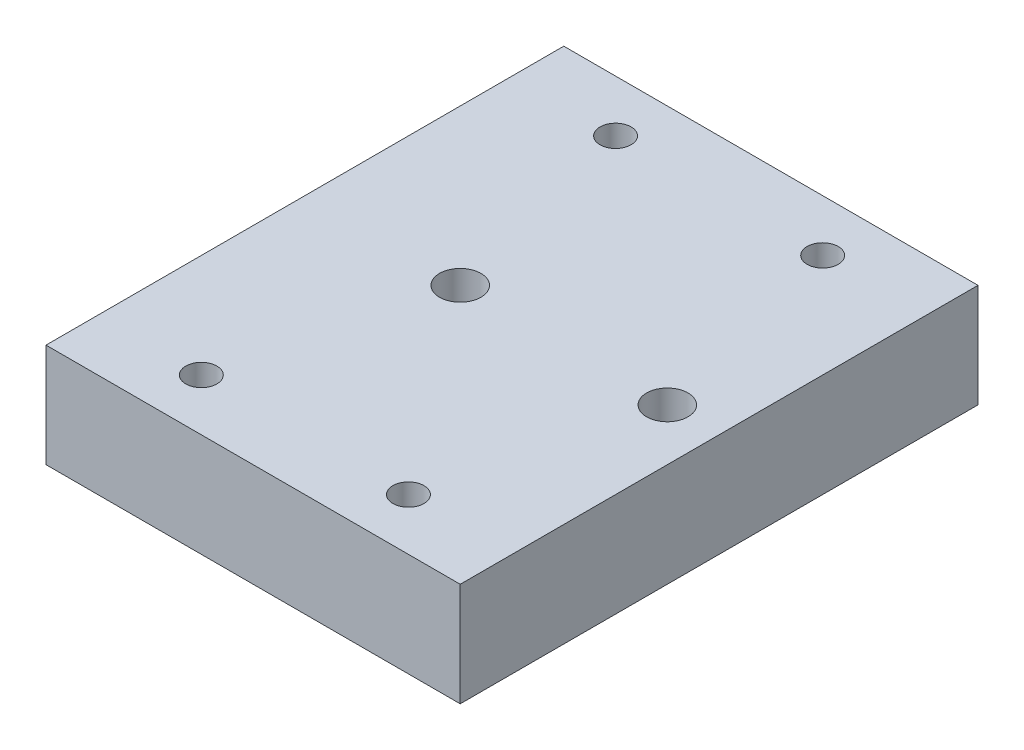
ISO-10303-21;
HEADER;
FILE_DESCRIPTION(('STEP AP214'),'2;1');
FILE_NAME('part.step','',(''),(''),'','','');
FILE_SCHEMA(('AUTOMOTIVE_DESIGN { 1 0 10303 214 1 1 1 1 }'));
ENDSEC;
DATA;
#1=APPLICATION_CONTEXT('core data for automotive mechanical design processes');
#2=APPLICATION_PROTOCOL_DEFINITION('international standard','automotive_design',2000,#1);
#3=PRODUCT_CONTEXT('',#1,'mechanical');
#4=PRODUCT('Part','Part','',(#3));
#5=PRODUCT_RELATED_PRODUCT_CATEGORY('part','',(#4));
#6=PRODUCT_DEFINITION_FORMATION('','',#4);
#7=PRODUCT_DEFINITION_CONTEXT('part definition',#1,'design');
#8=PRODUCT_DEFINITION('design','',#6,#7);
#9=PRODUCT_DEFINITION_SHAPE('','',#8);
#10=(LENGTH_UNIT() NAMED_UNIT(*) SI_UNIT(.MILLI.,.METRE.));
#11=(NAMED_UNIT(*) PLANE_ANGLE_UNIT() SI_UNIT($,.RADIAN.));
#12=(NAMED_UNIT(*) SI_UNIT($,.STERADIAN.) SOLID_ANGLE_UNIT());
#13=UNCERTAINTY_MEASURE_WITH_UNIT(LENGTH_MEASURE(1.E-05),#10,'distance_accuracy_value','');
#14=(GEOMETRIC_REPRESENTATION_CONTEXT(3) GLOBAL_UNCERTAINTY_ASSIGNED_CONTEXT((#13)) GLOBAL_UNIT_ASSIGNED_CONTEXT((#10,
#11,#12)) REPRESENTATION_CONTEXT('',''));
#15=CARTESIAN_POINT('',(0.,0.,0.));
#16=DIRECTION('',(0.,0.,1.));
#17=DIRECTION('',(1.,0.,0.));
#18=AXIS2_PLACEMENT_3D('',#15,#16,#17);
#19=CARTESIAN_POINT('',(0.,20.,0.));
#20=DIRECTION('',(0.,-1.,0.));
#21=DIRECTION('',(0.,0.,-1.));
#22=AXIS2_PLACEMENT_3D('',#19,#20,#21);
#23=PLANE('',#22);
#24=DIRECTION('',(0.,0.,1.));
#25=VECTOR('',#24,1.);
#26=CARTESIAN_POINT('',(0.,20.,0.));
#27=LINE('',#26,#25);
#28=CARTESIAN_POINT('',(0.,20.,-100.));
#29=VERTEX_POINT('',#28);
#30=CARTESIAN_POINT('',(0.,20.,0.));
#31=VERTEX_POINT('',#30);
#32=EDGE_CURVE('E87',#29,#31,#27,.T.);
#33=ORIENTED_EDGE('',*,*,#32,.T.);
#34=DIRECTION('',(1.,0.,0.));
#35=VECTOR('',#34,1.);
#36=CARTESIAN_POINT('',(0.,20.,0.));
#37=LINE('',#36,#35);
#38=CARTESIAN_POINT('',(80.,20.,0.));
#39=VERTEX_POINT('',#38);
#40=EDGE_CURVE('E82',#31,#39,#37,.T.);
#41=ORIENTED_EDGE('',*,*,#40,.T.);
#42=DIRECTION('',(0.,0.,-1.));
#43=VECTOR('',#42,1.);
#44=CARTESIAN_POINT('',(80.,20.,0.));
#45=LINE('',#44,#43);
#46=CARTESIAN_POINT('',(80.,20.,-100.));
#47=VERTEX_POINT('',#46);
#48=EDGE_CURVE('E85',#39,#47,#45,.T.);
#49=ORIENTED_EDGE('',*,*,#48,.T.);
#50=DIRECTION('',(-1.,0.,0.));
#51=VECTOR('',#50,1.);
#52=CARTESIAN_POINT('',(0.,20.,-100.));
#53=LINE('',#52,#51);
#54=EDGE_CURVE('E52',#47,#29,#53,.T.);
#55=ORIENTED_EDGE('',*,*,#54,.T.);
#56=EDGE_LOOP('',(#33,#41,#49,#55));
#57=FACE_BOUND('',#56,.T.);
#58=CARTESIAN_POINT('',(20.,20.,-90.));
#59=DIRECTION('',(0.,1.,0.));
#60=DIRECTION('',(0.,0.,1.));
#61=AXIS2_PLACEMENT_3D('',#58,#59,#60);
#62=CIRCLE('',#61,3.);
#63=CARTESIAN_POINT('',(20.,20.,-87.));
#64=VERTEX_POINT('',#63);
#65=EDGE_CURVE('E102',#64,#64,#62,.T.);
#66=ORIENTED_EDGE('',*,*,#65,.F.);
#67=EDGE_LOOP('',(#66));
#68=FACE_BOUND('',#67,.T.);
#69=CARTESIAN_POINT('',(60.,20.,-90.));
#70=DIRECTION('',(0.,1.,0.));
#71=DIRECTION('',(0.,0.,1.));
#72=AXIS2_PLACEMENT_3D('',#69,#70,#71);
#73=CIRCLE('',#72,3.00000000000001);
#74=CARTESIAN_POINT('',(60.,20.,-87.));
#75=VERTEX_POINT('',#74);
#76=EDGE_CURVE('E117',#75,#75,#73,.T.);
#77=ORIENTED_EDGE('',*,*,#76,.F.);
#78=EDGE_LOOP('',(#77));
#79=FACE_BOUND('',#78,.T.);
#80=CARTESIAN_POINT('',(20.,20.,-10.));
#81=DIRECTION('',(0.,1.,0.));
#82=DIRECTION('',(0.,0.,1.));
#83=AXIS2_PLACEMENT_3D('',#80,#81,#82);
#84=CIRCLE('',#83,3.);
#85=CARTESIAN_POINT('',(20.,20.,-7.));
#86=VERTEX_POINT('',#85);
#87=EDGE_CURVE('E123',#86,#86,#84,.T.);
#88=ORIENTED_EDGE('',*,*,#87,.F.);
#89=EDGE_LOOP('',(#88));
#90=FACE_BOUND('',#89,.T.);
#91=CARTESIAN_POINT('',(60.,20.,-10.));
#92=DIRECTION('',(0.,1.,0.));
#93=DIRECTION('',(0.,0.,1.));
#94=AXIS2_PLACEMENT_3D('',#91,#92,#93);
#95=CIRCLE('',#94,3.00000000000001);
#96=CARTESIAN_POINT('',(60.,20.,-6.99999999999999));
#97=VERTEX_POINT('',#96);
#98=EDGE_CURVE('E129',#97,#97,#95,.T.);
#99=ORIENTED_EDGE('',*,*,#98,.F.);
#100=EDGE_LOOP('',(#99));
#101=FACE_BOUND('',#100,.T.);
#102=CARTESIAN_POINT('',(30.,20.,-50.));
#103=DIRECTION('',(0.,1.,0.));
#104=DIRECTION('',(0.,0.,1.));
#105=AXIS2_PLACEMENT_3D('',#102,#103,#104);
#106=CIRCLE('',#105,4.00000000000001);
#107=CARTESIAN_POINT('',(30.,20.,-46.));
#108=VERTEX_POINT('',#107);
#109=EDGE_CURVE('E135',#108,#108,#106,.T.);
#110=ORIENTED_EDGE('',*,*,#109,.F.);
#111=EDGE_LOOP('',(#110));
#112=FACE_BOUND('',#111,.T.);
#113=CARTESIAN_POINT('',(70.,20.,-50.));
#114=DIRECTION('',(0.,1.,0.));
#115=DIRECTION('',(0.,0.,1.));
#116=AXIS2_PLACEMENT_3D('',#113,#114,#115);
#117=CIRCLE('',#116,4.00000000000001);
#118=CARTESIAN_POINT('',(70.,20.,-46.));
#119=VERTEX_POINT('',#118);
#120=EDGE_CURVE('E141',#119,#119,#117,.T.);
#121=ORIENTED_EDGE('',*,*,#120,.F.);
#122=EDGE_LOOP('',(#121));
#123=FACE_BOUND('',#122,.T.);
#124=ADVANCED_FACE('F35',(#57,#68,#79,#90,#101,#112,#123),#23,.F.);
#125=CARTESIAN_POINT('',(0.,0.,0.));
#126=DIRECTION('',(0.,-1.,0.));
#127=DIRECTION('',(0.,0.,-1.));
#128=AXIS2_PLACEMENT_3D('',#125,#126,#127);
#129=PLANE('',#128);
#130=CARTESIAN_POINT('',(30.,0.,-50.));
#131=DIRECTION('',(0.,1.,0.));
#132=DIRECTION('',(0.,0.,1.));
#133=AXIS2_PLACEMENT_3D('',#130,#131,#132);
#134=CIRCLE('',#133,4.00000000000001);
#135=CARTESIAN_POINT('',(30.,0.,-46.));
#136=VERTEX_POINT('',#135);
#137=EDGE_CURVE('E138',#136,#136,#134,.T.);
#138=ORIENTED_EDGE('',*,*,#137,.T.);
#139=EDGE_LOOP('',(#138));
#140=FACE_BOUND('',#139,.T.);
#141=CARTESIAN_POINT('',(20.,0.,-10.));
#142=DIRECTION('',(0.,1.,0.));
#143=DIRECTION('',(0.,0.,1.));
#144=AXIS2_PLACEMENT_3D('',#141,#142,#143);
#145=CIRCLE('',#144,3.);
#146=CARTESIAN_POINT('',(20.,0.,-7.));
#147=VERTEX_POINT('',#146);
#148=EDGE_CURVE('E126',#147,#147,#145,.T.);
#149=ORIENTED_EDGE('',*,*,#148,.T.);
#150=EDGE_LOOP('',(#149));
#151=FACE_BOUND('',#150,.T.);
#152=CARTESIAN_POINT('',(20.,0.,-90.));
#153=DIRECTION('',(0.,1.,0.));
#154=DIRECTION('',(0.,0.,1.));
#155=AXIS2_PLACEMENT_3D('',#152,#153,#154);
#156=CIRCLE('',#155,3.);
#157=CARTESIAN_POINT('',(20.,0.,-87.));
#158=VERTEX_POINT('',#157);
#159=EDGE_CURVE('E114',#158,#158,#156,.T.);
#160=ORIENTED_EDGE('',*,*,#159,.T.);
#161=EDGE_LOOP('',(#160));
#162=FACE_BOUND('',#161,.T.);
#163=DIRECTION('',(0.,0.,1.));
#164=VECTOR('',#163,1.);
#165=CARTESIAN_POINT('',(0.,0.,0.));
#166=LINE('',#165,#164);
#167=CARTESIAN_POINT('',(0.,0.,-100.));
#168=VERTEX_POINT('',#167);
#169=CARTESIAN_POINT('',(0.,0.,0.));
#170=VERTEX_POINT('',#169);
#171=EDGE_CURVE('E99',#168,#170,#166,.T.);
#172=ORIENTED_EDGE('',*,*,#171,.F.);
#173=DIRECTION('',(-1.,0.,0.));
#174=VECTOR('',#173,1.);
#175=CARTESIAN_POINT('',(0.,0.,-100.));
#176=LINE('',#175,#174);
#177=CARTESIAN_POINT('',(80.,0.,-100.));
#178=VERTEX_POINT('',#177);
#179=EDGE_CURVE('E75',#178,#168,#176,.T.);
#180=ORIENTED_EDGE('',*,*,#179,.F.);
#181=DIRECTION('',(0.,0.,-1.));
#182=VECTOR('',#181,1.);
#183=CARTESIAN_POINT('',(80.,0.,0.));
#184=LINE('',#183,#182);
#185=CARTESIAN_POINT('',(80.,0.,0.));
#186=VERTEX_POINT('',#185);
#187=EDGE_CURVE('E69',#186,#178,#184,.T.);
#188=ORIENTED_EDGE('',*,*,#187,.F.);
#189=DIRECTION('',(1.,0.,0.));
#190=VECTOR('',#189,1.);
#191=CARTESIAN_POINT('',(0.,0.,0.));
#192=LINE('',#191,#190);
#193=EDGE_CURVE('E91',#170,#186,#192,.T.);
#194=ORIENTED_EDGE('',*,*,#193,.F.);
#195=EDGE_LOOP('',(#172,#180,#188,#194));
#196=FACE_BOUND('',#195,.T.);
#197=CARTESIAN_POINT('',(60.,0.,-90.));
#198=DIRECTION('',(0.,1.,0.));
#199=DIRECTION('',(0.,0.,1.));
#200=AXIS2_PLACEMENT_3D('',#197,#198,#199);
#201=CIRCLE('',#200,3.00000000000001);
#202=CARTESIAN_POINT('',(60.,0.,-87.));
#203=VERTEX_POINT('',#202);
#204=EDGE_CURVE('E120',#203,#203,#201,.T.);
#205=ORIENTED_EDGE('',*,*,#204,.T.);
#206=EDGE_LOOP('',(#205));
#207=FACE_BOUND('',#206,.T.);
#208=CARTESIAN_POINT('',(60.,0.,-10.));
#209=DIRECTION('',(0.,1.,0.));
#210=DIRECTION('',(0.,0.,1.));
#211=AXIS2_PLACEMENT_3D('',#208,#209,#210);
#212=CIRCLE('',#211,3.00000000000001);
#213=CARTESIAN_POINT('',(60.,0.,-6.99999999999999));
#214=VERTEX_POINT('',#213);
#215=EDGE_CURVE('E132',#214,#214,#212,.T.);
#216=ORIENTED_EDGE('',*,*,#215,.T.);
#217=EDGE_LOOP('',(#216));
#218=FACE_BOUND('',#217,.T.);
#219=CARTESIAN_POINT('',(70.,0.,-50.));
#220=DIRECTION('',(0.,1.,0.));
#221=DIRECTION('',(0.,0.,1.));
#222=AXIS2_PLACEMENT_3D('',#219,#220,#221);
#223=CIRCLE('',#222,4.00000000000001);
#224=CARTESIAN_POINT('',(70.,0.,-46.));
#225=VERTEX_POINT('',#224);
#226=EDGE_CURVE('E144',#225,#225,#223,.T.);
#227=ORIENTED_EDGE('',*,*,#226,.T.);
#228=EDGE_LOOP('',(#227));
#229=FACE_BOUND('',#228,.T.);
#230=ADVANCED_FACE('F110',(#140,#151,#162,#196,#207,#218,#229),#129,.T.);
#231=CARTESIAN_POINT('',(0.,20.,0.));
#232=DIRECTION('',(1.,0.,0.));
#233=DIRECTION('',(0.,0.,-1.));
#234=AXIS2_PLACEMENT_3D('',#231,#232,#233);
#235=PLANE('',#234);
#236=ORIENTED_EDGE('',*,*,#171,.T.);
#237=DIRECTION('',(0.,-1.,0.));
#238=VECTOR('',#237,1.);
#239=CARTESIAN_POINT('',(0.,20.,0.));
#240=LINE('',#239,#238);
#241=EDGE_CURVE('E11',#31,#170,#240,.T.);
#242=ORIENTED_EDGE('',*,*,#241,.F.);
#243=ORIENTED_EDGE('',*,*,#32,.F.);
#244=DIRECTION('',(0.,-1.,0.));
#245=VECTOR('',#244,1.);
#246=CARTESIAN_POINT('',(0.,20.,-100.));
#247=LINE('',#246,#245);
#248=EDGE_CURVE('E95',#29,#168,#247,.T.);
#249=ORIENTED_EDGE('',*,*,#248,.T.);
#250=EDGE_LOOP('',(#236,#242,#243,#249));
#251=FACE_BOUND('',#250,.T.);
#252=ADVANCED_FACE('F37',(#251),#235,.F.);
#253=CARTESIAN_POINT('',(0.,20.,0.));
#254=DIRECTION('',(0.,0.,-1.));
#255=DIRECTION('',(-1.,0.,0.));
#256=AXIS2_PLACEMENT_3D('',#253,#254,#255);
#257=PLANE('',#256);
#258=ORIENTED_EDGE('',*,*,#193,.T.);
#259=DIRECTION('',(0.,-1.,0.));
#260=VECTOR('',#259,1.);
#261=CARTESIAN_POINT('',(80.,20.,0.));
#262=LINE('',#261,#260);
#263=EDGE_CURVE('E44',#39,#186,#262,.T.);
#264=ORIENTED_EDGE('',*,*,#263,.F.);
#265=ORIENTED_EDGE('',*,*,#40,.F.);
#266=ORIENTED_EDGE('',*,*,#241,.T.);
#267=EDGE_LOOP('',(#258,#264,#265,#266));
#268=FACE_BOUND('',#267,.T.);
#269=ADVANCED_FACE('F90',(#268),#257,.F.);
#270=CARTESIAN_POINT('',(80.,20.,0.));
#271=DIRECTION('',(-1.,0.,0.));
#272=DIRECTION('',(0.,0.,1.));
#273=AXIS2_PLACEMENT_3D('',#270,#271,#272);
#274=PLANE('',#273);
#275=ORIENTED_EDGE('',*,*,#187,.T.);
#276=DIRECTION('',(0.,-1.,0.));
#277=VECTOR('',#276,1.);
#278=CARTESIAN_POINT('',(80.,20.,-100.));
#279=LINE('',#278,#277);
#280=EDGE_CURVE('E92',#47,#178,#279,.T.);
#281=ORIENTED_EDGE('',*,*,#280,.F.);
#282=ORIENTED_EDGE('',*,*,#48,.F.);
#283=ORIENTED_EDGE('',*,*,#263,.T.);
#284=EDGE_LOOP('',(#275,#281,#282,#283));
#285=FACE_BOUND('',#284,.T.);
#286=ADVANCED_FACE('F93',(#285),#274,.F.);
#287=CARTESIAN_POINT('',(0.,20.,-100.));
#288=DIRECTION('',(0.,0.,1.));
#289=DIRECTION('',(1.,0.,0.));
#290=AXIS2_PLACEMENT_3D('',#287,#288,#289);
#291=PLANE('',#290);
#292=ORIENTED_EDGE('',*,*,#179,.T.);
#293=ORIENTED_EDGE('',*,*,#248,.F.);
#294=ORIENTED_EDGE('',*,*,#54,.F.);
#295=ORIENTED_EDGE('',*,*,#280,.T.);
#296=EDGE_LOOP('',(#292,#293,#294,#295));
#297=FACE_BOUND('',#296,.T.);
#298=ADVANCED_FACE('F107',(#297),#291,.F.);
#299=CARTESIAN_POINT('',(20.,20.,-90.));
#300=DIRECTION('',(0.,-1.,0.));
#301=DIRECTION('',(0.,0.,-1.));
#302=AXIS2_PLACEMENT_3D('',#299,#300,#301);
#303=CYLINDRICAL_SURFACE('',#302,3.);
#304=ORIENTED_EDGE('',*,*,#65,.T.);
#305=EDGE_LOOP('',(#304));
#306=FACE_BOUND('',#305,.T.);
#307=ORIENTED_EDGE('',*,*,#159,.F.);
#308=EDGE_LOOP('',(#307));
#309=FACE_BOUND('',#308,.T.);
#310=ADVANCED_FACE('F161',(#306,#309),#303,.F.);
#311=CARTESIAN_POINT('',(60.,20.,-90.));
#312=DIRECTION('',(0.,-1.,0.));
#313=DIRECTION('',(0.,0.,-1.));
#314=AXIS2_PLACEMENT_3D('',#311,#312,#313);
#315=CYLINDRICAL_SURFACE('',#314,3.00000000000001);
#316=ORIENTED_EDGE('',*,*,#76,.T.);
#317=EDGE_LOOP('',(#316));
#318=FACE_BOUND('',#317,.T.);
#319=ORIENTED_EDGE('',*,*,#204,.F.);
#320=EDGE_LOOP('',(#319));
#321=FACE_BOUND('',#320,.T.);
#322=ADVANCED_FACE('F207',(#318,#321),#315,.F.);
#323=CARTESIAN_POINT('',(20.,20.,-10.));
#324=DIRECTION('',(0.,-1.,0.));
#325=DIRECTION('',(0.,0.,-1.));
#326=AXIS2_PLACEMENT_3D('',#323,#324,#325);
#327=CYLINDRICAL_SURFACE('',#326,3.);
#328=ORIENTED_EDGE('',*,*,#87,.T.);
#329=EDGE_LOOP('',(#328));
#330=FACE_BOUND('',#329,.T.);
#331=ORIENTED_EDGE('',*,*,#148,.F.);
#332=EDGE_LOOP('',(#331));
#333=FACE_BOUND('',#332,.T.);
#334=ADVANCED_FACE('F215',(#330,#333),#327,.F.);
#335=CARTESIAN_POINT('',(60.,20.,-10.));
#336=DIRECTION('',(0.,-1.,0.));
#337=DIRECTION('',(0.,0.,-1.));
#338=AXIS2_PLACEMENT_3D('',#335,#336,#337);
#339=CYLINDRICAL_SURFACE('',#338,3.00000000000001);
#340=ORIENTED_EDGE('',*,*,#98,.T.);
#341=EDGE_LOOP('',(#340));
#342=FACE_BOUND('',#341,.T.);
#343=ORIENTED_EDGE('',*,*,#215,.F.);
#344=EDGE_LOOP('',(#343));
#345=FACE_BOUND('',#344,.T.);
#346=ADVANCED_FACE('F223',(#342,#345),#339,.F.);
#347=CARTESIAN_POINT('',(30.,20.,-50.));
#348=DIRECTION('',(0.,-1.,0.));
#349=DIRECTION('',(0.,0.,-1.));
#350=AXIS2_PLACEMENT_3D('',#347,#348,#349);
#351=CYLINDRICAL_SURFACE('',#350,4.00000000000001);
#352=ORIENTED_EDGE('',*,*,#109,.T.);
#353=EDGE_LOOP('',(#352));
#354=FACE_BOUND('',#353,.T.);
#355=ORIENTED_EDGE('',*,*,#137,.F.);
#356=EDGE_LOOP('',(#355));
#357=FACE_BOUND('',#356,.T.);
#358=ADVANCED_FACE('F232',(#354,#357),#351,.F.);
#359=CARTESIAN_POINT('',(70.,20.,-50.));
#360=DIRECTION('',(0.,-1.,0.));
#361=DIRECTION('',(0.,0.,-1.));
#362=AXIS2_PLACEMENT_3D('',#359,#360,#361);
#363=CYLINDRICAL_SURFACE('',#362,4.00000000000001);
#364=ORIENTED_EDGE('',*,*,#120,.T.);
#365=EDGE_LOOP('',(#364));
#366=FACE_BOUND('',#365,.T.);
#367=ORIENTED_EDGE('',*,*,#226,.F.);
#368=EDGE_LOOP('',(#367));
#369=FACE_BOUND('',#368,.T.);
#370=ADVANCED_FACE('F150',(#366,#369),#363,.F.);
#371=CLOSED_SHELL('',(#124,#230,#252,#269,#286,#298,#310,#322,#334,#346,#358,#370));
#372=MANIFOLD_SOLID_BREP('B2',#371);
#373=ADVANCED_BREP_SHAPE_REPRESENTATION('',(#18,#372),#14);
#374=SHAPE_DEFINITION_REPRESENTATION(#9,#373);
ENDSEC;
END-ISO-10303-21;
